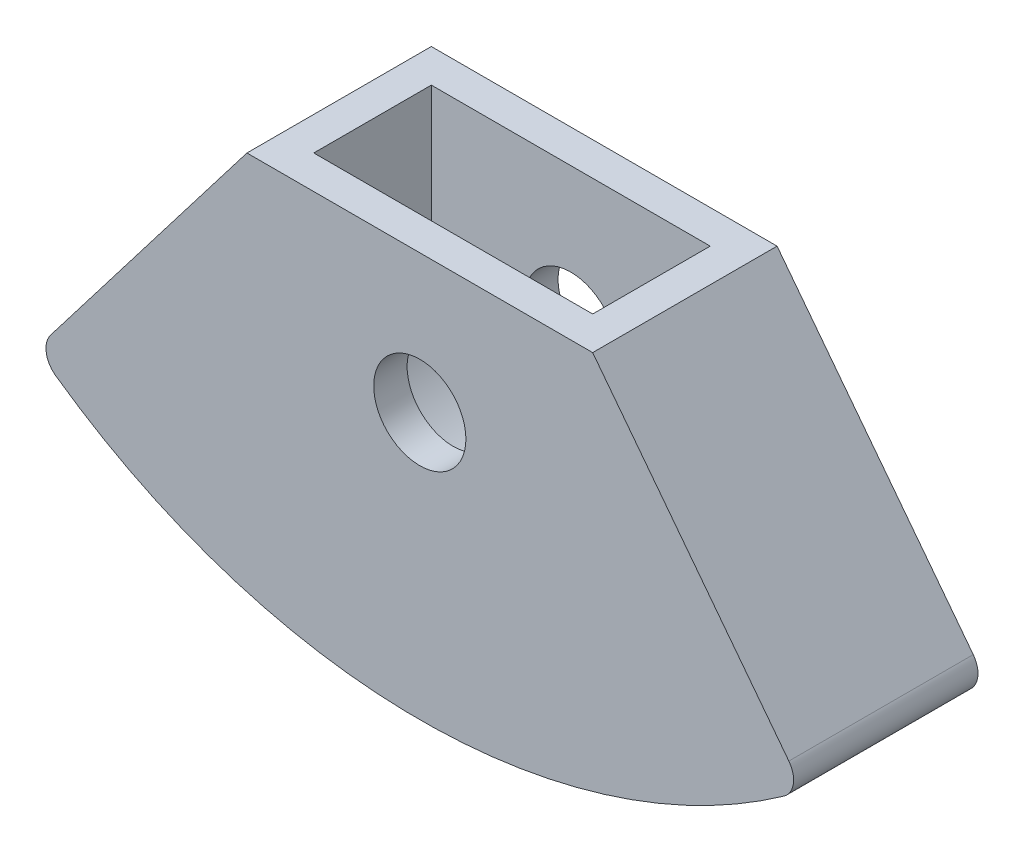
ISO-10303-21;
HEADER;
FILE_DESCRIPTION(('STEP AP214'),'2;1');
FILE_NAME('part.step','',(''),(''),'','','');
FILE_SCHEMA(('AUTOMOTIVE_DESIGN { 1 0 10303 214 1 1 1 1 }'));
ENDSEC;
DATA;
#1=APPLICATION_CONTEXT('core data for automotive mechanical design processes');
#2=APPLICATION_PROTOCOL_DEFINITION('international standard','automotive_design',2000,#1);
#3=PRODUCT_CONTEXT('',#1,'mechanical');
#4=PRODUCT('Part','Part','',(#3));
#5=PRODUCT_RELATED_PRODUCT_CATEGORY('part','',(#4));
#6=PRODUCT_DEFINITION_FORMATION('','',#4);
#7=PRODUCT_DEFINITION_CONTEXT('part definition',#1,'design');
#8=PRODUCT_DEFINITION('design','',#6,#7);
#9=PRODUCT_DEFINITION_SHAPE('','',#8);
#10=(LENGTH_UNIT() NAMED_UNIT(*) SI_UNIT(.MILLI.,.METRE.));
#11=(NAMED_UNIT(*) PLANE_ANGLE_UNIT() SI_UNIT($,.RADIAN.));
#12=(NAMED_UNIT(*) SI_UNIT($,.STERADIAN.) SOLID_ANGLE_UNIT());
#13=UNCERTAINTY_MEASURE_WITH_UNIT(LENGTH_MEASURE(1.E-05),#10,'distance_accuracy_value','');
#14=(GEOMETRIC_REPRESENTATION_CONTEXT(3) GLOBAL_UNCERTAINTY_ASSIGNED_CONTEXT((#13)) GLOBAL_UNIT_ASSIGNED_CONTEXT((#10,
#11,#12)) REPRESENTATION_CONTEXT('',''));
#15=CARTESIAN_POINT('',(0.,0.,0.));
#16=DIRECTION('',(0.,0.,1.));
#17=DIRECTION('',(1.,0.,0.));
#18=AXIS2_PLACEMENT_3D('',#15,#16,#17);
#19=CARTESIAN_POINT('',(0.,0.,-4.));
#20=DIRECTION('',(0.,1.,0.));
#21=DIRECTION('',(-1.,0.,0.));
#22=AXIS2_PLACEMENT_3D('',#19,#20,#21);
#23=PLANE('',#22);
#24=DIRECTION('',(-1.,0.,0.));
#25=VECTOR('',#24,1.);
#26=CARTESIAN_POINT('',(0.,0.,4.));
#27=LINE('',#26,#25);
#28=CARTESIAN_POINT('',(15.,0.,4.));
#29=VERTEX_POINT('',#28);
#30=CARTESIAN_POINT('',(0.,0.,4.));
#31=VERTEX_POINT('',#30);
#32=EDGE_CURVE('E147',#29,#31,#27,.T.);
#33=ORIENTED_EDGE('',*,*,#32,.F.);
#34=DIRECTION('',(0.,0.,1.));
#35=VECTOR('',#34,1.);
#36=CARTESIAN_POINT('',(15.,0.,-4.));
#37=LINE('',#36,#35);
#38=CARTESIAN_POINT('',(15.,0.,-4.));
#39=VERTEX_POINT('',#38);
#40=EDGE_CURVE('E43',#39,#29,#37,.T.);
#41=ORIENTED_EDGE('',*,*,#40,.F.);
#42=DIRECTION('',(-1.,0.,0.));
#43=VECTOR('',#42,1.);
#44=CARTESIAN_POINT('',(0.,0.,-4.));
#45=LINE('',#44,#43);
#46=CARTESIAN_POINT('',(0.,0.,-4.));
#47=VERTEX_POINT('',#46);
#48=EDGE_CURVE('E124',#39,#47,#45,.T.);
#49=ORIENTED_EDGE('',*,*,#48,.T.);
#50=DIRECTION('',(0.,0.,1.));
#51=VECTOR('',#50,1.);
#52=CARTESIAN_POINT('',(0.,0.,-4.));
#53=LINE('',#52,#51);
#54=EDGE_CURVE('E11',#47,#31,#53,.T.);
#55=ORIENTED_EDGE('',*,*,#54,.T.);
#56=EDGE_LOOP('',(#33,#41,#49,#55));
#57=FACE_BOUND('',#56,.T.);
#58=DIRECTION('',(0.,0.,1.));
#59=VECTOR('',#58,1.);
#60=CARTESIAN_POINT('',(1.45,0.,-2.55));
#61=LINE('',#60,#59);
#62=CARTESIAN_POINT('',(1.45,0.,-2.55));
#63=VERTEX_POINT('',#62);
#64=CARTESIAN_POINT('',(1.45,0.,2.55));
#65=VERTEX_POINT('',#64);
#66=EDGE_CURVE('E165',#63,#65,#61,.T.);
#67=ORIENTED_EDGE('',*,*,#66,.F.);
#68=DIRECTION('',(-1.,0.,0.));
#69=VECTOR('',#68,1.);
#70=CARTESIAN_POINT('',(13.55,0.,-2.55));
#71=LINE('',#70,#69);
#72=CARTESIAN_POINT('',(13.55,0.,-2.55));
#73=VERTEX_POINT('',#72);
#74=EDGE_CURVE('E168',#73,#63,#71,.T.);
#75=ORIENTED_EDGE('',*,*,#74,.F.);
#76=DIRECTION('',(0.,0.,1.));
#77=VECTOR('',#76,1.);
#78=CARTESIAN_POINT('',(13.55,0.,-2.55));
#79=LINE('',#78,#77);
#80=CARTESIAN_POINT('',(13.55,0.,2.55));
#81=VERTEX_POINT('',#80);
#82=EDGE_CURVE('E138',#73,#81,#79,.T.);
#83=ORIENTED_EDGE('',*,*,#82,.T.);
#84=DIRECTION('',(-1.,0.,0.));
#85=VECTOR('',#84,1.);
#86=CARTESIAN_POINT('',(13.55,0.,2.55));
#87=LINE('',#86,#85);
#88=EDGE_CURVE('E169',#81,#65,#87,.T.);
#89=ORIENTED_EDGE('',*,*,#88,.T.);
#90=EDGE_LOOP('',(#67,#75,#83,#89));
#91=FACE_BOUND('',#90,.T.);
#92=ADVANCED_FACE('F34',(#57,#91),#23,.T.);
#93=CARTESIAN_POINT('',(-8.51109125557457,-11.0918700748317,-4.));
#94=DIRECTION('',(-0.793353340291234,0.608761429008722,0.));
#95=DIRECTION('',(-0.608761429008722,-0.793353340291234,0.));
#96=AXIS2_PLACEMENT_3D('',#93,#94,#95);
#97=PLANE('',#96);
#98=DIRECTION('',(-0.608761429008722,-0.793353340291234,0.));
#99=VECTOR('',#98,1.);
#100=CARTESIAN_POINT('',(-8.51109125557457,-11.0918700748317,4.));
#101=LINE('',#100,#99);
#102=CARTESIAN_POINT('',(-8.51109125557457,-11.0918700748317,4.));
#103=VERTEX_POINT('',#102);
#104=EDGE_CURVE('E134',#31,#103,#101,.T.);
#105=ORIENTED_EDGE('',*,*,#104,.F.);
#106=ORIENTED_EDGE('',*,*,#54,.F.);
#107=DIRECTION('',(-0.608761429008722,-0.793353340291234,0.));
#108=VECTOR('',#107,1.);
#109=CARTESIAN_POINT('',(-8.51109125557457,-11.0918700748317,-4.));
#110=LINE('',#109,#108);
#111=CARTESIAN_POINT('',(-8.51109125557457,-11.0918700748317,-4.));
#112=VERTEX_POINT('',#111);
#113=EDGE_CURVE('E149',#47,#112,#110,.T.);
#114=ORIENTED_EDGE('',*,*,#113,.T.);
#115=DIRECTION('',(0.,0.,1.));
#116=VECTOR('',#115,1.);
#117=CARTESIAN_POINT('',(-8.51109125557457,-11.0918700748317,-4.));
#118=LINE('',#117,#116);
#119=EDGE_CURVE('E91',#112,#103,#118,.T.);
#120=ORIENTED_EDGE('',*,*,#119,.T.);
#121=EDGE_LOOP('',(#105,#106,#114,#120));
#122=FACE_BOUND('',#121,.T.);
#123=ADVANCED_FACE('F36',(#122),#97,.T.);
#124=CARTESIAN_POINT('',(15.,0.,-4.));
#125=DIRECTION('',(0.793353340291239,0.608761429008716,0.));
#126=DIRECTION('',(-0.608761429008716,0.793353340291239,0.));
#127=AXIS2_PLACEMENT_3D('',#124,#125,#126);
#128=PLANE('',#127);
#129=DIRECTION('',(-0.608761429008716,0.793353340291239,0.));
#130=VECTOR('',#129,1.);
#131=CARTESIAN_POINT('',(15.,0.,4.));
#132=LINE('',#131,#130);
#133=CARTESIAN_POINT('',(23.5110912555745,-11.0918700748317,4.));
#134=VERTEX_POINT('',#133);
#135=EDGE_CURVE('E111',#134,#29,#132,.T.);
#136=ORIENTED_EDGE('',*,*,#135,.F.);
#137=DIRECTION('',(0.,0.,1.));
#138=VECTOR('',#137,1.);
#139=CARTESIAN_POINT('',(23.5110912555745,-11.0918700748317,-4.));
#140=LINE('',#139,#138);
#141=CARTESIAN_POINT('',(23.5110912555745,-11.0918700748317,-4.));
#142=VERTEX_POINT('',#141);
#143=EDGE_CURVE('E105',#142,#134,#140,.T.);
#144=ORIENTED_EDGE('',*,*,#143,.F.);
#145=DIRECTION('',(-0.608761429008716,0.793353340291239,0.));
#146=VECTOR('',#145,1.);
#147=CARTESIAN_POINT('',(15.,0.,-4.));
#148=LINE('',#147,#146);
#149=EDGE_CURVE('E108',#142,#39,#148,.T.);
#150=ORIENTED_EDGE('',*,*,#149,.T.);
#151=ORIENTED_EDGE('',*,*,#40,.T.);
#152=EDGE_LOOP('',(#136,#144,#150,#151));
#153=FACE_BOUND('',#152,.T.);
#154=ADVANCED_FACE('F107',(#153),#128,.T.);
#155=CARTESIAN_POINT('',(22.7177379152832,-11.7006315038404,-4.));
#156=DIRECTION('',(0.,0.,1.));
#157=DIRECTION('',(1.,0.,0.));
#158=AXIS2_PLACEMENT_3D('',#155,#156,#157);
#159=CYLINDRICAL_SURFACE('',#158,1.);
#160=CARTESIAN_POINT('',(22.7177379152832,-11.7006315038404,4.));
#161=DIRECTION('',(0.,0.,1.));
#162=DIRECTION('',(-1.,0.,0.));
#163=AXIS2_PLACEMENT_3D('',#160,#161,#162);
#164=CIRCLE('',#163,1.);
#165=CARTESIAN_POINT('',(23.2959173109671,-12.5165411718838,4.));
#166=VERTEX_POINT('',#165);
#167=EDGE_CURVE('E144',#166,#134,#164,.T.);
#168=ORIENTED_EDGE('',*,*,#167,.F.);
#169=DIRECTION('',(0.,0.,1.));
#170=VECTOR('',#169,1.);
#171=CARTESIAN_POINT('',(23.2959173109671,-12.5165411718838,-4.));
#172=LINE('',#171,#170);
#173=CARTESIAN_POINT('',(23.2959173109671,-12.5165411718838,-4.));
#174=VERTEX_POINT('',#173);
#175=EDGE_CURVE('E116',#174,#166,#172,.T.);
#176=ORIENTED_EDGE('',*,*,#175,.F.);
#177=CARTESIAN_POINT('',(22.7177379152832,-11.7006315038404,-4.));
#178=DIRECTION('',(0.,0.,1.));
#179=DIRECTION('',(-1.,0.,0.));
#180=AXIS2_PLACEMENT_3D('',#177,#178,#179);
#181=CIRCLE('',#180,1.);
#182=EDGE_CURVE('E122',#174,#142,#181,.T.);
#183=ORIENTED_EDGE('',*,*,#182,.T.);
#184=ORIENTED_EDGE('',*,*,#143,.T.);
#185=EDGE_LOOP('',(#168,#176,#183,#184));
#186=FACE_BOUND('',#185,.T.);
#187=ADVANCED_FACE('F126',(#186),#159,.T.);
#188=CARTESIAN_POINT('',(7.5,9.77419029630916,-4.));
#189=DIRECTION('',(0.,0.,1.));
#190=DIRECTION('',(1.,0.,0.));
#191=AXIS2_PLACEMENT_3D('',#188,#189,#190);
#192=CYLINDRICAL_SURFACE('',#191,27.3200972377845);
#193=CARTESIAN_POINT('',(7.5,9.77419029630916,4.));
#194=DIRECTION('',(0.,0.,1.));
#195=DIRECTION('',(-1.,0.,0.));
#196=AXIS2_PLACEMENT_3D('',#193,#194,#195);
#197=CIRCLE('',#196,27.3200972377845);
#198=CARTESIAN_POINT('',(-8.29591731096721,-12.5165411718837,4.));
#199=VERTEX_POINT('',#198);
#200=EDGE_CURVE('E141',#199,#166,#197,.T.);
#201=ORIENTED_EDGE('',*,*,#200,.F.);
#202=DIRECTION('',(0.,0.,1.));
#203=VECTOR('',#202,1.);
#204=CARTESIAN_POINT('',(-8.29591731096721,-12.5165411718837,-4.));
#205=LINE('',#204,#203);
#206=CARTESIAN_POINT('',(-8.29591731096721,-12.5165411718837,-4.));
#207=VERTEX_POINT('',#206);
#208=EDGE_CURVE('E153',#207,#199,#205,.T.);
#209=ORIENTED_EDGE('',*,*,#208,.F.);
#210=CARTESIAN_POINT('',(7.5,9.77419029630916,-4.));
#211=DIRECTION('',(0.,0.,1.));
#212=DIRECTION('',(-1.,0.,0.));
#213=AXIS2_PLACEMENT_3D('',#210,#211,#212);
#214=CIRCLE('',#213,27.3200972377845);
#215=EDGE_CURVE('E127',#207,#174,#214,.T.);
#216=ORIENTED_EDGE('',*,*,#215,.T.);
#217=ORIENTED_EDGE('',*,*,#175,.T.);
#218=EDGE_LOOP('',(#201,#209,#216,#217));
#219=FACE_BOUND('',#218,.T.);
#220=ADVANCED_FACE('F186',(#219),#192,.T.);
#221=CARTESIAN_POINT('',(-7.71773791528333,-11.7006315038404,-4.));
#222=DIRECTION('',(0.,0.,1.));
#223=DIRECTION('',(1.,0.,0.));
#224=AXIS2_PLACEMENT_3D('',#221,#222,#223);
#225=CYLINDRICAL_SURFACE('',#224,0.999999999999998);
#226=CARTESIAN_POINT('',(-7.71773791528333,-11.7006315038404,4.));
#227=DIRECTION('',(0.,0.,1.));
#228=DIRECTION('',(1.,0.,0.));
#229=AXIS2_PLACEMENT_3D('',#226,#227,#228);
#230=CIRCLE('',#229,0.999999999999998);
#231=EDGE_CURVE('E137',#103,#199,#230,.T.);
#232=ORIENTED_EDGE('',*,*,#231,.F.);
#233=ORIENTED_EDGE('',*,*,#119,.F.);
#234=CARTESIAN_POINT('',(-7.71773791528333,-11.7006315038404,-4.));
#235=DIRECTION('',(0.,0.,1.));
#236=DIRECTION('',(1.,0.,0.));
#237=AXIS2_PLACEMENT_3D('',#234,#235,#236);
#238=CIRCLE('',#237,0.999999999999998);
#239=EDGE_CURVE('E129',#112,#207,#238,.T.);
#240=ORIENTED_EDGE('',*,*,#239,.T.);
#241=ORIENTED_EDGE('',*,*,#208,.T.);
#242=EDGE_LOOP('',(#232,#233,#240,#241));
#243=FACE_BOUND('',#242,.T.);
#244=ADVANCED_FACE('F154',(#243),#225,.T.);
#245=CARTESIAN_POINT('',(22.7177379152832,-11.7006315038404,-4.));
#246=DIRECTION('',(0.,0.,-1.));
#247=DIRECTION('',(-1.,0.,0.));
#248=AXIS2_PLACEMENT_3D('',#245,#246,#247);
#249=PLANE('',#248);
#250=CARTESIAN_POINT('',(7.5,-6.,-4.));
#251=DIRECTION('',(0.,0.,1.));
#252=DIRECTION('',(1.,0.,0.));
#253=AXIS2_PLACEMENT_3D('',#250,#251,#252);
#254=CIRCLE('',#253,2.);
#255=CARTESIAN_POINT('',(9.5,-6.,-4.));
#256=VERTEX_POINT('',#255);
#257=EDGE_CURVE('E236',#256,#256,#254,.T.);
#258=ORIENTED_EDGE('',*,*,#257,.T.);
#259=EDGE_LOOP('',(#258));
#260=FACE_BOUND('',#259,.T.);
#261=ORIENTED_EDGE('',*,*,#113,.F.);
#262=ORIENTED_EDGE('',*,*,#48,.F.);
#263=ORIENTED_EDGE('',*,*,#149,.F.);
#264=ORIENTED_EDGE('',*,*,#182,.F.);
#265=ORIENTED_EDGE('',*,*,#215,.F.);
#266=ORIENTED_EDGE('',*,*,#239,.F.);
#267=EDGE_LOOP('',(#261,#262,#263,#264,#265,#266));
#268=FACE_BOUND('',#267,.T.);
#269=ADVANCED_FACE('F120',(#260,#268),#249,.T.);
#270=CARTESIAN_POINT('',(22.7177379152832,-11.7006315038404,4.));
#271=DIRECTION('',(0.,0.,-1.));
#272=DIRECTION('',(-1.,0.,0.));
#273=AXIS2_PLACEMENT_3D('',#270,#271,#272);
#274=PLANE('',#273);
#275=CARTESIAN_POINT('',(7.5,-6.,4.));
#276=DIRECTION('',(0.,0.,1.));
#277=DIRECTION('',(1.,0.,0.));
#278=AXIS2_PLACEMENT_3D('',#275,#276,#277);
#279=CIRCLE('',#278,2.);
#280=CARTESIAN_POINT('',(9.5,-6.,4.));
#281=VERTEX_POINT('',#280);
#282=EDGE_CURVE('E237',#281,#281,#279,.T.);
#283=ORIENTED_EDGE('',*,*,#282,.F.);
#284=EDGE_LOOP('',(#283));
#285=FACE_BOUND('',#284,.T.);
#286=ORIENTED_EDGE('',*,*,#104,.T.);
#287=ORIENTED_EDGE('',*,*,#231,.T.);
#288=ORIENTED_EDGE('',*,*,#200,.T.);
#289=ORIENTED_EDGE('',*,*,#167,.T.);
#290=ORIENTED_EDGE('',*,*,#135,.T.);
#291=ORIENTED_EDGE('',*,*,#32,.T.);
#292=EDGE_LOOP('',(#286,#287,#288,#289,#290,#291));
#293=FACE_BOUND('',#292,.T.);
#294=ADVANCED_FACE('F157',(#285,#293),#274,.F.);
#295=CARTESIAN_POINT('',(13.55,-6.,-2.55));
#296=DIRECTION('',(1.,0.,0.));
#297=DIRECTION('',(0.,1.,0.));
#298=AXIS2_PLACEMENT_3D('',#295,#296,#297);
#299=PLANE('',#298);
#300=DIRECTION('',(0.,1.,0.));
#301=VECTOR('',#300,1.);
#302=CARTESIAN_POINT('',(13.55,-6.,2.55));
#303=LINE('',#302,#301);
#304=CARTESIAN_POINT('',(13.55,-6.,2.55));
#305=VERTEX_POINT('',#304);
#306=EDGE_CURVE('E246',#305,#81,#303,.T.);
#307=ORIENTED_EDGE('',*,*,#306,.T.);
#308=ORIENTED_EDGE('',*,*,#82,.F.);
#309=DIRECTION('',(0.,1.,0.));
#310=VECTOR('',#309,1.);
#311=CARTESIAN_POINT('',(13.55,-6.,-2.55));
#312=LINE('',#311,#310);
#313=CARTESIAN_POINT('',(13.55,-6.,-2.55));
#314=VERTEX_POINT('',#313);
#315=EDGE_CURVE('E175',#314,#73,#312,.T.);
#316=ORIENTED_EDGE('',*,*,#315,.F.);
#317=DIRECTION('',(0.,0.,1.));
#318=VECTOR('',#317,1.);
#319=CARTESIAN_POINT('',(13.55,-6.,-2.55));
#320=LINE('',#319,#318);
#321=EDGE_CURVE('E178',#314,#305,#320,.T.);
#322=ORIENTED_EDGE('',*,*,#321,.T.);
#323=EDGE_LOOP('',(#307,#308,#316,#322));
#324=FACE_BOUND('',#323,.T.);
#325=ADVANCED_FACE('F199',(#324),#299,.F.);
#326=CARTESIAN_POINT('',(7.5,-6.,-2.55));
#327=DIRECTION('',(0.,0.,1.));
#328=DIRECTION('',(1.,0.,0.));
#329=AXIS2_PLACEMENT_3D('',#326,#327,#328);
#330=CYLINDRICAL_SURFACE('',#329,6.05);
#331=CARTESIAN_POINT('',(7.5,-6.,2.55));
#332=DIRECTION('',(0.,0.,1.));
#333=DIRECTION('',(1.,0.,0.));
#334=AXIS2_PLACEMENT_3D('',#331,#332,#333);
#335=CIRCLE('',#334,6.05);
#336=CARTESIAN_POINT('',(1.45,-6.,2.55));
#337=VERTEX_POINT('',#336);
#338=EDGE_CURVE('E253',#337,#305,#335,.T.);
#339=ORIENTED_EDGE('',*,*,#338,.T.);
#340=ORIENTED_EDGE('',*,*,#321,.F.);
#341=CARTESIAN_POINT('',(7.5,-6.,-2.55));
#342=DIRECTION('',(0.,0.,1.));
#343=DIRECTION('',(1.,0.,0.));
#344=AXIS2_PLACEMENT_3D('',#341,#342,#343);
#345=CIRCLE('',#344,6.05);
#346=CARTESIAN_POINT('',(1.45,-6.,-2.55));
#347=VERTEX_POINT('',#346);
#348=EDGE_CURVE('E181',#347,#314,#345,.T.);
#349=ORIENTED_EDGE('',*,*,#348,.F.);
#350=DIRECTION('',(0.,0.,1.));
#351=VECTOR('',#350,1.);
#352=CARTESIAN_POINT('',(1.45,-6.,-2.55));
#353=LINE('',#352,#351);
#354=EDGE_CURVE('E174',#347,#337,#353,.T.);
#355=ORIENTED_EDGE('',*,*,#354,.T.);
#356=EDGE_LOOP('',(#339,#340,#349,#355));
#357=FACE_BOUND('',#356,.T.);
#358=ADVANCED_FACE('F208',(#357),#330,.F.);
#359=CARTESIAN_POINT('',(1.45,0.,-2.55));
#360=DIRECTION('',(-1.,0.,0.));
#361=DIRECTION('',(0.,-1.,0.));
#362=AXIS2_PLACEMENT_3D('',#359,#360,#361);
#363=PLANE('',#362);
#364=DIRECTION('',(0.,-1.,0.));
#365=VECTOR('',#364,1.);
#366=CARTESIAN_POINT('',(1.45,0.,2.55));
#367=LINE('',#366,#365);
#368=EDGE_CURVE('E51',#65,#337,#367,.T.);
#369=ORIENTED_EDGE('',*,*,#368,.T.);
#370=ORIENTED_EDGE('',*,*,#354,.F.);
#371=DIRECTION('',(0.,-1.,0.));
#372=VECTOR('',#371,1.);
#373=CARTESIAN_POINT('',(1.45,0.,-2.55));
#374=LINE('',#373,#372);
#375=EDGE_CURVE('E245',#63,#347,#374,.T.);
#376=ORIENTED_EDGE('',*,*,#375,.F.);
#377=ORIENTED_EDGE('',*,*,#66,.T.);
#378=EDGE_LOOP('',(#369,#370,#376,#377));
#379=FACE_BOUND('',#378,.T.);
#380=ADVANCED_FACE('F204',(#379),#363,.F.);
#381=CARTESIAN_POINT('',(7.5,-6.,-2.55));
#382=DIRECTION('',(0.,0.,1.));
#383=DIRECTION('',(1.,0.,0.));
#384=AXIS2_PLACEMENT_3D('',#381,#382,#383);
#385=PLANE('',#384);
#386=CARTESIAN_POINT('',(7.5,-6.,-2.55));
#387=DIRECTION('',(0.,0.,1.));
#388=DIRECTION('',(1.,0.,0.));
#389=AXIS2_PLACEMENT_3D('',#386,#387,#388);
#390=CIRCLE('',#389,2.);
#391=CARTESIAN_POINT('',(9.5,-6.,-2.55));
#392=VERTEX_POINT('',#391);
#393=EDGE_CURVE('E233',#392,#392,#390,.T.);
#394=ORIENTED_EDGE('',*,*,#393,.F.);
#395=EDGE_LOOP('',(#394));
#396=FACE_BOUND('',#395,.T.);
#397=ORIENTED_EDGE('',*,*,#74,.T.);
#398=ORIENTED_EDGE('',*,*,#375,.T.);
#399=ORIENTED_EDGE('',*,*,#348,.T.);
#400=ORIENTED_EDGE('',*,*,#315,.T.);
#401=EDGE_LOOP('',(#397,#398,#399,#400));
#402=FACE_BOUND('',#401,.T.);
#403=ADVANCED_FACE('F207',(#396,#402),#385,.T.);
#404=CARTESIAN_POINT('',(7.5,-6.,2.55));
#405=DIRECTION('',(0.,0.,1.));
#406=DIRECTION('',(1.,0.,0.));
#407=AXIS2_PLACEMENT_3D('',#404,#405,#406);
#408=PLANE('',#407);
#409=CARTESIAN_POINT('',(7.5,-6.,2.55));
#410=DIRECTION('',(0.,0.,1.));
#411=DIRECTION('',(1.,0.,0.));
#412=AXIS2_PLACEMENT_3D('',#409,#410,#411);
#413=CIRCLE('',#412,2.);
#414=CARTESIAN_POINT('',(9.5,-6.,2.55));
#415=VERTEX_POINT('',#414);
#416=EDGE_CURVE('E38',#415,#415,#413,.T.);
#417=ORIENTED_EDGE('',*,*,#416,.T.);
#418=EDGE_LOOP('',(#417));
#419=FACE_BOUND('',#418,.T.);
#420=ORIENTED_EDGE('',*,*,#88,.F.);
#421=ORIENTED_EDGE('',*,*,#306,.F.);
#422=ORIENTED_EDGE('',*,*,#338,.F.);
#423=ORIENTED_EDGE('',*,*,#368,.F.);
#424=EDGE_LOOP('',(#420,#421,#422,#423));
#425=FACE_BOUND('',#424,.T.);
#426=ADVANCED_FACE('F215',(#419,#425),#408,.F.);
#427=CARTESIAN_POINT('',(7.5,-6.,-4.));
#428=DIRECTION('',(0.,0.,1.));
#429=DIRECTION('',(1.,0.,0.));
#430=AXIS2_PLACEMENT_3D('',#427,#428,#429);
#431=CYLINDRICAL_SURFACE('',#430,2.);
#432=ORIENTED_EDGE('',*,*,#282,.T.);
#433=EDGE_LOOP('',(#432));
#434=FACE_BOUND('',#433,.T.);
#435=ORIENTED_EDGE('',*,*,#416,.F.);
#436=EDGE_LOOP('',(#435));
#437=FACE_BOUND('',#436,.T.);
#438=ADVANCED_FACE('F218',(#434,#437),#431,.F.);
#439=ORIENTED_EDGE('',*,*,#393,.T.);
#440=EDGE_LOOP('',(#439));
#441=FACE_BOUND('',#440,.T.);
#442=ORIENTED_EDGE('',*,*,#257,.F.);
#443=EDGE_LOOP('',(#442));
#444=FACE_BOUND('',#443,.T.);
#445=ADVANCED_FACE('F223',(#441,#444),#431,.F.);
#446=CLOSED_SHELL('',(#92,#123,#154,#187,#220,#244,#269,#294,#325,#358,#380,#403,#426,#438,#445));
#447=MANIFOLD_SOLID_BREP('B2',#446);
#448=ADVANCED_BREP_SHAPE_REPRESENTATION('',(#18,#447),#14);
#449=SHAPE_DEFINITION_REPRESENTATION(#9,#448);
ENDSEC;
END-ISO-10303-21;
